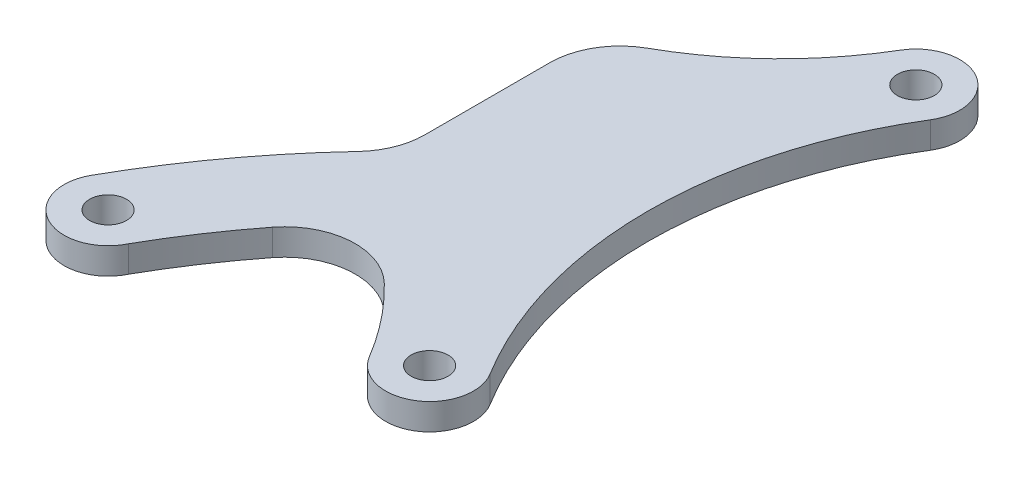
ISO-10303-21;
HEADER;
FILE_DESCRIPTION(('STEP AP214'),'2;1');
FILE_NAME('part.step','',(''),(''),'','','');
FILE_SCHEMA(('AUTOMOTIVE_DESIGN { 1 0 10303 214 1 1 1 1 }'));
ENDSEC;
DATA;
#1=APPLICATION_CONTEXT('core data for automotive mechanical design processes');
#2=APPLICATION_PROTOCOL_DEFINITION('international standard','automotive_design',2000,#1);
#3=PRODUCT_CONTEXT('',#1,'mechanical');
#4=PRODUCT('Part','Part','',(#3));
#5=PRODUCT_RELATED_PRODUCT_CATEGORY('part','',(#4));
#6=PRODUCT_DEFINITION_FORMATION('','',#4);
#7=PRODUCT_DEFINITION_CONTEXT('part definition',#1,'design');
#8=PRODUCT_DEFINITION('design','',#6,#7);
#9=PRODUCT_DEFINITION_SHAPE('','',#8);
#10=(LENGTH_UNIT() NAMED_UNIT(*) SI_UNIT(.MILLI.,.METRE.));
#11=(NAMED_UNIT(*) PLANE_ANGLE_UNIT() SI_UNIT($,.RADIAN.));
#12=(NAMED_UNIT(*) SI_UNIT($,.STERADIAN.) SOLID_ANGLE_UNIT());
#13=UNCERTAINTY_MEASURE_WITH_UNIT(LENGTH_MEASURE(1.E-05),#10,'distance_accuracy_value','');
#14=(GEOMETRIC_REPRESENTATION_CONTEXT(3) GLOBAL_UNCERTAINTY_ASSIGNED_CONTEXT((#13)) GLOBAL_UNIT_ASSIGNED_CONTEXT((#10,
#11,#12)) REPRESENTATION_CONTEXT('',''));
#15=CARTESIAN_POINT('',(0.,0.,0.));
#16=DIRECTION('',(0.,0.,1.));
#17=DIRECTION('',(1.,0.,0.));
#18=AXIS2_PLACEMENT_3D('',#15,#16,#17);
#19=CARTESIAN_POINT('',(0.,3.,0.));
#20=DIRECTION('',(-1.,0.,0.));
#21=DIRECTION('',(0.,0.,1.));
#22=AXIS2_PLACEMENT_3D('',#19,#20,#21);
#23=PLANE('',#22);
#24=DIRECTION('',(0.,0.,-1.));
#25=VECTOR('',#24,1.);
#26=CARTESIAN_POINT('',(0.,3.,0.));
#27=LINE('',#26,#25);
#28=CARTESIAN_POINT('',(0.,3.,5.15464700704357));
#29=VERTEX_POINT('',#28);
#30=CARTESIAN_POINT('',(0.,3.,-9.00422180832725));
#31=VERTEX_POINT('',#30);
#32=EDGE_CURVE('E158',#29,#31,#27,.T.);
#33=ORIENTED_EDGE('',*,*,#32,.T.);
#34=DIRECTION('',(0.,1.,0.));
#35=VECTOR('',#34,1.);
#36=CARTESIAN_POINT('',(0.,0.,-9.00422180832725));
#37=LINE('',#36,#35);
#38=CARTESIAN_POINT('',(0.,0.,-9.00422180832725));
#39=VERTEX_POINT('',#38);
#40=EDGE_CURVE('E261',#31,#39,#37,.F.);
#41=ORIENTED_EDGE('',*,*,#40,.T.);
#42=DIRECTION('',(0.,0.,-1.));
#43=VECTOR('',#42,1.);
#44=CARTESIAN_POINT('',(0.,0.,0.));
#45=LINE('',#44,#43);
#46=CARTESIAN_POINT('',(0.,0.,5.15464700704357));
#47=VERTEX_POINT('',#46);
#48=EDGE_CURVE('E196',#47,#39,#45,.T.);
#49=ORIENTED_EDGE('',*,*,#48,.F.);
#50=DIRECTION('',(0.,1.,0.));
#51=VECTOR('',#50,1.);
#52=CARTESIAN_POINT('',(0.,3.,5.15464700704357));
#53=LINE('',#52,#51);
#54=EDGE_CURVE('E258',#47,#29,#53,.T.);
#55=ORIENTED_EDGE('',*,*,#54,.T.);
#56=EDGE_LOOP('',(#33,#41,#49,#55));
#57=FACE_BOUND('',#56,.T.);
#58=ADVANCED_FACE('F41',(#57),#23,.T.);
#59=CARTESIAN_POINT('',(63.2934056347811,3.,71.9789128556918));
#60=DIRECTION('',(0.,-1.,0.));
#61=DIRECTION('',(0.,0.,-1.));
#62=AXIS2_PLACEMENT_3D('',#59,#60,#61);
#63=CYLINDRICAL_SURFACE('',#62,89.7150561234872);
#64=CARTESIAN_POINT('',(63.2934056347811,3.,71.9789128556918));
#65=DIRECTION('',(0.,1.,0.));
#66=DIRECTION('',(0.,0.,1.));
#67=AXIS2_PLACEMENT_3D('',#64,#65,#66);
#68=CIRCLE('',#67,89.7150561234872);
#69=CARTESIAN_POINT('',(-14.9841354073367,3.,28.1449321598889));
#70=VERTEX_POINT('',#69);
#71=CARTESIAN_POINT('',(-2.16315900839813,3.,10.6255963980319));
#72=VERTEX_POINT('',#71);
#73=EDGE_CURVE('E136',#70,#72,#68,.F.);
#74=ORIENTED_EDGE('',*,*,#73,.T.);
#75=DIRECTION('',(0.,-1.,0.));
#76=VECTOR('',#75,1.);
#77=CARTESIAN_POINT('',(-2.16315900839813,3.,10.6255963980319));
#78=LINE('',#77,#76);
#79=CARTESIAN_POINT('',(-2.16315900839813,0.,10.6255963980319));
#80=VERTEX_POINT('',#79);
#81=EDGE_CURVE('E273',#72,#80,#78,.T.);
#82=ORIENTED_EDGE('',*,*,#81,.T.);
#83=CARTESIAN_POINT('',(63.2934056347811,0.,71.9789128556918));
#84=DIRECTION('',(0.,1.,0.));
#85=DIRECTION('',(0.,0.,1.));
#86=AXIS2_PLACEMENT_3D('',#83,#84,#85);
#87=CIRCLE('',#86,89.7150561234872);
#88=CARTESIAN_POINT('',(-14.9841354073367,0.,28.1449321598889));
#89=VERTEX_POINT('',#88);
#90=EDGE_CURVE('E139',#89,#80,#87,.F.);
#91=ORIENTED_EDGE('',*,*,#90,.F.);
#92=DIRECTION('',(0.,-1.,0.));
#93=VECTOR('',#92,1.);
#94=CARTESIAN_POINT('',(-14.9841354073367,3.,28.1449321598889));
#95=LINE('',#94,#93);
#96=EDGE_CURVE('E132',#70,#89,#95,.T.);
#97=ORIENTED_EDGE('',*,*,#96,.F.);
#98=EDGE_LOOP('',(#74,#82,#91,#97));
#99=FACE_BOUND('',#98,.T.);
#100=ADVANCED_FACE('F134',(#99),#63,.T.);
#101=CARTESIAN_POINT('',(-10.6215710605913,3.,30.5878878124757));
#102=DIRECTION('',(0.,-1.,0.));
#103=DIRECTION('',(0.,0.,-1.));
#104=AXIS2_PLACEMENT_3D('',#101,#102,#103);
#105=CYLINDRICAL_SURFACE('',#104,5.);
#106=CARTESIAN_POINT('',(-10.6215710605913,0.,30.5878878124757));
#107=DIRECTION('',(0.,1.,0.));
#108=DIRECTION('',(0.,0.,1.));
#109=AXIS2_PLACEMENT_3D('',#106,#107,#108);
#110=CIRCLE('',#109,5.);
#111=CARTESIAN_POINT('',(-6.11371947179426,0.,32.7510507867752));
#112=VERTEX_POINT('',#111);
#113=EDGE_CURVE('E202',#89,#112,#110,.T.);
#114=ORIENTED_EDGE('',*,*,#113,.T.);
#115=DIRECTION('',(0.,-1.,0.));
#116=VECTOR('',#115,1.);
#117=CARTESIAN_POINT('',(-6.11371947179426,3.,32.7510507867752));
#118=LINE('',#117,#116);
#119=CARTESIAN_POINT('',(-6.11371947179426,3.,32.7510507867752));
#120=VERTEX_POINT('',#119);
#121=EDGE_CURVE('E144',#120,#112,#118,.T.);
#122=ORIENTED_EDGE('',*,*,#121,.F.);
#123=CARTESIAN_POINT('',(-10.6215710605913,3.,30.5878878124757));
#124=DIRECTION('',(0.,1.,0.));
#125=DIRECTION('',(0.,0.,1.));
#126=AXIS2_PLACEMENT_3D('',#123,#124,#125);
#127=CIRCLE('',#126,5.);
#128=EDGE_CURVE('E147',#70,#120,#127,.T.);
#129=ORIENTED_EDGE('',*,*,#128,.F.);
#130=ORIENTED_EDGE('',*,*,#96,.T.);
#131=EDGE_LOOP('',(#114,#122,#129,#130));
#132=FACE_BOUND('',#131,.T.);
#133=ADVANCED_FACE('F148',(#132),#105,.T.);
#134=CARTESIAN_POINT('',(63.2934056347817,3.,71.9789128556922));
#135=DIRECTION('',(0.,-1.,0.));
#136=DIRECTION('',(0.,0.,-1.));
#137=AXIS2_PLACEMENT_3D('',#134,#135,#136);
#138=CYLINDRICAL_SURFACE('',#137,79.7256180788702);
#139=CARTESIAN_POINT('',(63.2934056347817,0.,71.9789128556922));
#140=DIRECTION('',(0.,1.,0.));
#141=DIRECTION('',(0.,0.,1.));
#142=AXIS2_PLACEMENT_3D('',#139,#140,#141);
#143=CIRCLE('',#142,79.7256180788702);
#144=CARTESIAN_POINT('',(0.43927315495626,0.,22.9326876363502));
#145=VERTEX_POINT('',#144);
#146=EDGE_CURVE('E205',#112,#145,#143,.F.);
#147=ORIENTED_EDGE('',*,*,#146,.T.);
#148=DIRECTION('',(0.,-1.,0.));
#149=VECTOR('',#148,1.);
#150=CARTESIAN_POINT('',(0.439273154956246,3.,22.9326876363502));
#151=LINE('',#150,#149);
#152=CARTESIAN_POINT('',(0.43927315495626,3.,22.9326876363502));
#153=VERTEX_POINT('',#152);
#154=EDGE_CURVE('E255',#145,#153,#151,.F.);
#155=ORIENTED_EDGE('',*,*,#154,.T.);
#156=CARTESIAN_POINT('',(63.2934056347817,3.,71.9789128556922));
#157=DIRECTION('',(0.,1.,0.));
#158=DIRECTION('',(0.,0.,1.));
#159=AXIS2_PLACEMENT_3D('',#156,#157,#158);
#160=CIRCLE('',#159,79.7256180788702);
#161=EDGE_CURVE('E153',#120,#153,#160,.F.);
#162=ORIENTED_EDGE('',*,*,#161,.F.);
#163=ORIENTED_EDGE('',*,*,#121,.T.);
#164=EDGE_LOOP('',(#147,#155,#162,#163));
#165=FACE_BOUND('',#164,.T.);
#166=ADVANCED_FACE('F338',(#165),#138,.F.);
#167=CARTESIAN_POINT('',(-15.081183554011,3.,50.304084356289));
#168=DIRECTION('',(0.,-1.,0.));
#169=DIRECTION('',(0.,0.,-1.));
#170=AXIS2_PLACEMENT_3D('',#167,#168,#169);
#171=CYLINDRICAL_SURFACE('',#170,39.3119401497601);
#172=CARTESIAN_POINT('',(-15.081183554011,3.,50.304084356289));
#173=DIRECTION('',(0.,1.,0.));
#174=DIRECTION('',(0.,0.,1.));
#175=AXIS2_PLACEMENT_3D('',#172,#173,#174);
#176=CIRCLE('',#175,39.3119401497601);
#177=CARTESIAN_POINT('',(18.7030561711687,3.,30.2029952183864));
#178=VERTEX_POINT('',#177);
#179=CARTESIAN_POINT('',(12.3231049118581,3.,22.1183856419099));
#180=VERTEX_POINT('',#179);
#181=EDGE_CURVE('E167',#178,#180,#176,.T.);
#182=ORIENTED_EDGE('',*,*,#181,.T.);
#183=DIRECTION('',(0.,-1.,0.));
#184=VECTOR('',#183,1.);
#185=CARTESIAN_POINT('',(12.3231049118581,3.,22.1183856419099));
#186=LINE('',#185,#184);
#187=CARTESIAN_POINT('',(12.3231049118581,0.,22.1183856419099));
#188=VERTEX_POINT('',#187);
#189=EDGE_CURVE('E143',#180,#188,#186,.T.);
#190=ORIENTED_EDGE('',*,*,#189,.T.);
#191=CARTESIAN_POINT('',(-15.081183554011,0.,50.304084356289));
#192=DIRECTION('',(0.,1.,0.));
#193=DIRECTION('',(0.,0.,1.));
#194=AXIS2_PLACEMENT_3D('',#191,#192,#193);
#195=CIRCLE('',#194,39.3119401497601);
#196=CARTESIAN_POINT('',(18.7030561711687,0.,30.2029952183864));
#197=VERTEX_POINT('',#196);
#198=EDGE_CURVE('E209',#197,#188,#195,.T.);
#199=ORIENTED_EDGE('',*,*,#198,.F.);
#200=DIRECTION('',(0.,-1.,0.));
#201=VECTOR('',#200,1.);
#202=CARTESIAN_POINT('',(18.7030561711687,3.,30.2029952183864));
#203=LINE('',#202,#201);
#204=EDGE_CURVE('E247',#178,#197,#203,.T.);
#205=ORIENTED_EDGE('',*,*,#204,.F.);
#206=EDGE_LOOP('',(#182,#190,#199,#205));
#207=FACE_BOUND('',#206,.T.);
#208=ADVANCED_FACE('F316',(#207),#171,.F.);
#209=CARTESIAN_POINT('',(23.,3.,27.6463814947534));
#210=DIRECTION('',(0.,-1.,0.));
#211=DIRECTION('',(0.,0.,-1.));
#212=AXIS2_PLACEMENT_3D('',#209,#210,#211);
#213=CYLINDRICAL_SURFACE('',#212,4.99999999999999);
#214=CARTESIAN_POINT('',(23.,0.,27.6463814947534));
#215=DIRECTION('',(0.,1.,0.));
#216=DIRECTION('',(0.,0.,1.));
#217=AXIS2_PLACEMENT_3D('',#214,#215,#216);
#218=CIRCLE('',#217,4.99999999999999);
#219=CARTESIAN_POINT('',(27.2602311164125,0.,25.0290487236388));
#220=VERTEX_POINT('',#219);
#221=EDGE_CURVE('E213',#197,#220,#218,.T.);
#222=ORIENTED_EDGE('',*,*,#221,.T.);
#223=DIRECTION('',(0.,-1.,0.));
#224=VECTOR('',#223,1.);
#225=CARTESIAN_POINT('',(27.2602311164125,3.,25.0290487236388));
#226=LINE('',#225,#224);
#227=CARTESIAN_POINT('',(27.2602311164125,3.,25.0290487236388));
#228=VERTEX_POINT('',#227);
#229=EDGE_CURVE('E243',#228,#220,#226,.T.);
#230=ORIENTED_EDGE('',*,*,#229,.F.);
#231=CARTESIAN_POINT('',(23.,3.,27.6463814947534));
#232=DIRECTION('',(0.,1.,0.));
#233=DIRECTION('',(0.,0.,1.));
#234=AXIS2_PLACEMENT_3D('',#231,#232,#233);
#235=CIRCLE('',#234,4.99999999999999);
#236=EDGE_CURVE('E171',#178,#228,#235,.T.);
#237=ORIENTED_EDGE('',*,*,#236,.F.);
#238=ORIENTED_EDGE('',*,*,#204,.T.);
#239=EDGE_LOOP('',(#222,#230,#237,#238));
#240=FACE_BOUND('',#239,.T.);
#241=ADVANCED_FACE('F322',(#240),#213,.T.);
#242=CARTESIAN_POINT('',(68.,3.,0.));
#243=DIRECTION('',(0.,-1.,0.));
#244=DIRECTION('',(0.,0.,-1.));
#245=AXIS2_PLACEMENT_3D('',#242,#243,#244);
#246=CYLINDRICAL_SURFACE('',#245,47.8140361055037);
#247=CARTESIAN_POINT('',(68.,0.,0.));
#248=DIRECTION('',(0.,1.,0.));
#249=DIRECTION('',(0.,0.,1.));
#250=AXIS2_PLACEMENT_3D('',#247,#248,#249);
#251=CIRCLE('',#250,47.8140361055037);
#252=CARTESIAN_POINT('',(27.2602311164125,0.,-25.0290487236388));
#253=VERTEX_POINT('',#252);
#254=EDGE_CURVE('E216',#220,#253,#251,.F.);
#255=ORIENTED_EDGE('',*,*,#254,.T.);
#256=DIRECTION('',(0.,-1.,0.));
#257=VECTOR('',#256,1.);
#258=CARTESIAN_POINT('',(27.2602311164125,3.,-25.0290487236388));
#259=LINE('',#258,#257);
#260=CARTESIAN_POINT('',(27.2602311164125,3.,-25.0290487236388));
#261=VERTEX_POINT('',#260);
#262=EDGE_CURVE('E239',#261,#253,#259,.T.);
#263=ORIENTED_EDGE('',*,*,#262,.F.);
#264=CARTESIAN_POINT('',(68.,3.,0.));
#265=DIRECTION('',(0.,1.,0.));
#266=DIRECTION('',(0.,0.,1.));
#267=AXIS2_PLACEMENT_3D('',#264,#265,#266);
#268=CIRCLE('',#267,47.8140361055037);
#269=EDGE_CURVE('E174',#228,#261,#268,.F.);
#270=ORIENTED_EDGE('',*,*,#269,.F.);
#271=ORIENTED_EDGE('',*,*,#229,.T.);
#272=EDGE_LOOP('',(#255,#263,#270,#271));
#273=FACE_BOUND('',#272,.T.);
#274=ADVANCED_FACE('F328',(#273),#246,.F.);
#275=CARTESIAN_POINT('',(23.,3.,-27.6463814947534));
#276=DIRECTION('',(0.,-1.,0.));
#277=DIRECTION('',(0.,0.,-1.));
#278=AXIS2_PLACEMENT_3D('',#275,#276,#277);
#279=CYLINDRICAL_SURFACE('',#278,4.99999999999999);
#280=CARTESIAN_POINT('',(23.,0.,-27.6463814947534));
#281=DIRECTION('',(0.,1.,0.));
#282=DIRECTION('',(0.,0.,1.));
#283=AXIS2_PLACEMENT_3D('',#280,#281,#282);
#284=CIRCLE('',#283,4.99999999999999);
#285=CARTESIAN_POINT('',(18.7030561711687,0.,-30.2029952183864));
#286=VERTEX_POINT('',#285);
#287=EDGE_CURVE('E219',#253,#286,#284,.T.);
#288=ORIENTED_EDGE('',*,*,#287,.T.);
#289=DIRECTION('',(0.,-1.,0.));
#290=VECTOR('',#289,1.);
#291=CARTESIAN_POINT('',(18.7030561711687,3.,-30.2029952183864));
#292=LINE('',#291,#290);
#293=CARTESIAN_POINT('',(18.7030561711687,3.,-30.2029952183864));
#294=VERTEX_POINT('',#293);
#295=EDGE_CURVE('E195',#294,#286,#292,.T.);
#296=ORIENTED_EDGE('',*,*,#295,.F.);
#297=CARTESIAN_POINT('',(23.,3.,-27.6463814947534));
#298=DIRECTION('',(0.,1.,0.));
#299=DIRECTION('',(0.,0.,1.));
#300=AXIS2_PLACEMENT_3D('',#297,#298,#299);
#301=CIRCLE('',#300,4.99999999999999);
#302=EDGE_CURVE('E177',#261,#294,#301,.T.);
#303=ORIENTED_EDGE('',*,*,#302,.F.);
#304=ORIENTED_EDGE('',*,*,#262,.T.);
#305=EDGE_LOOP('',(#288,#296,#303,#304));
#306=FACE_BOUND('',#305,.T.);
#307=ADVANCED_FACE('F332',(#306),#279,.T.);
#308=CARTESIAN_POINT('',(23.,3.,-27.6463814947534));
#309=DIRECTION('',(0.,-1.,0.));
#310=DIRECTION('',(0.,0.,-1.));
#311=AXIS2_PLACEMENT_3D('',#308,#309,#310);
#312=CYLINDRICAL_SURFACE('',#311,2.09999999999999);
#313=CARTESIAN_POINT('',(23.,3.,-27.6463814947534));
#314=DIRECTION('',(0.,1.,0.));
#315=DIRECTION('',(0.,0.,1.));
#316=AXIS2_PLACEMENT_3D('',#313,#314,#315);
#317=CIRCLE('',#316,2.09999999999999);
#318=CARTESIAN_POINT('',(23.,3.,-25.5463814947534));
#319=VERTEX_POINT('',#318);
#320=EDGE_CURVE('E187',#319,#319,#317,.T.);
#321=ORIENTED_EDGE('',*,*,#320,.T.);
#322=EDGE_LOOP('',(#321));
#323=FACE_BOUND('',#322,.T.);
#324=CARTESIAN_POINT('',(23.,0.,-27.6463814947534));
#325=DIRECTION('',(0.,1.,0.));
#326=DIRECTION('',(0.,0.,1.));
#327=AXIS2_PLACEMENT_3D('',#324,#325,#326);
#328=CIRCLE('',#327,2.09999999999999);
#329=CARTESIAN_POINT('',(23.,0.,-25.5463814947534));
#330=VERTEX_POINT('',#329);
#331=EDGE_CURVE('E229',#330,#330,#328,.T.);
#332=ORIENTED_EDGE('',*,*,#331,.F.);
#333=EDGE_LOOP('',(#332));
#334=FACE_BOUND('',#333,.T.);
#335=ADVANCED_FACE('F353',(#323,#334),#312,.F.);
#336=CARTESIAN_POINT('',(-10.6215710605966,3.,30.5878878124869));
#337=DIRECTION('',(0.,-1.,0.));
#338=DIRECTION('',(0.,0.,-1.));
#339=AXIS2_PLACEMENT_3D('',#336,#337,#338);
#340=CYLINDRICAL_SURFACE('',#339,2.10000000000002);
#341=CARTESIAN_POINT('',(-10.6215710605966,3.,30.5878878124869));
#342=DIRECTION('',(0.,1.,0.));
#343=DIRECTION('',(0.,0.,1.));
#344=AXIS2_PLACEMENT_3D('',#341,#342,#343);
#345=CIRCLE('',#344,2.10000000000002);
#346=CARTESIAN_POINT('',(-10.6215710605966,3.,32.6878878124869));
#347=VERTEX_POINT('',#346);
#348=EDGE_CURVE('E183',#347,#347,#345,.T.);
#349=ORIENTED_EDGE('',*,*,#348,.T.);
#350=EDGE_LOOP('',(#349));
#351=FACE_BOUND('',#350,.T.);
#352=CARTESIAN_POINT('',(-10.6215710605966,0.,30.5878878124869));
#353=DIRECTION('',(0.,1.,0.));
#354=DIRECTION('',(0.,0.,1.));
#355=AXIS2_PLACEMENT_3D('',#352,#353,#354);
#356=CIRCLE('',#355,2.10000000000002);
#357=CARTESIAN_POINT('',(-10.6215710605966,0.,32.6878878124869));
#358=VERTEX_POINT('',#357);
#359=EDGE_CURVE('E225',#358,#358,#356,.T.);
#360=ORIENTED_EDGE('',*,*,#359,.F.);
#361=EDGE_LOOP('',(#360));
#362=FACE_BOUND('',#361,.T.);
#363=ADVANCED_FACE('F357',(#351,#362),#340,.F.);
#364=CARTESIAN_POINT('',(-15.081183554011,3.,-50.304084356289));
#365=DIRECTION('',(0.,-1.,0.));
#366=DIRECTION('',(0.,0.,-1.));
#367=AXIS2_PLACEMENT_3D('',#364,#365,#366);
#368=CYLINDRICAL_SURFACE('',#367,39.3119401497601);
#369=CARTESIAN_POINT('',(-15.081183554011,0.,-50.304084356289));
#370=DIRECTION('',(0.,1.,0.));
#371=DIRECTION('',(0.,0.,1.));
#372=AXIS2_PLACEMENT_3D('',#369,#370,#371);
#373=CIRCLE('',#372,39.3119401497601);
#374=CARTESIAN_POINT('',(4.09719094487347,0.,-15.9876365517907));
#375=VERTEX_POINT('',#374);
#376=EDGE_CURVE('E222',#286,#375,#373,.F.);
#377=ORIENTED_EDGE('',*,*,#376,.T.);
#378=DIRECTION('',(0.,-1.,0.));
#379=VECTOR('',#378,1.);
#380=CARTESIAN_POINT('',(4.09719094487347,3.,-15.9876365517907));
#381=LINE('',#380,#379);
#382=CARTESIAN_POINT('',(4.09719094487347,3.,-15.9876365517907));
#383=VERTEX_POINT('',#382);
#384=EDGE_CURVE('E63',#375,#383,#381,.F.);
#385=ORIENTED_EDGE('',*,*,#384,.T.);
#386=CARTESIAN_POINT('',(-15.081183554011,3.,-50.304084356289));
#387=DIRECTION('',(0.,1.,0.));
#388=DIRECTION('',(0.,0.,1.));
#389=AXIS2_PLACEMENT_3D('',#386,#387,#388);
#390=CIRCLE('',#389,39.3119401497601);
#391=EDGE_CURVE('E180',#294,#383,#390,.F.);
#392=ORIENTED_EDGE('',*,*,#391,.F.);
#393=ORIENTED_EDGE('',*,*,#295,.T.);
#394=EDGE_LOOP('',(#377,#385,#392,#393));
#395=FACE_BOUND('',#394,.T.);
#396=ADVANCED_FACE('F334',(#395),#368,.F.);
#397=CARTESIAN_POINT('',(23.,3.,27.6463814947534));
#398=DIRECTION('',(0.,-1.,0.));
#399=DIRECTION('',(0.,0.,-1.));
#400=AXIS2_PLACEMENT_3D('',#397,#398,#399);
#401=CYLINDRICAL_SURFACE('',#400,2.09999999999999);
#402=CARTESIAN_POINT('',(23.,3.,27.6463814947534));
#403=DIRECTION('',(0.,1.,0.));
#404=DIRECTION('',(0.,0.,1.));
#405=AXIS2_PLACEMENT_3D('',#402,#403,#404);
#406=CIRCLE('',#405,2.09999999999999);
#407=CARTESIAN_POINT('',(23.,3.,29.7463814947534));
#408=VERTEX_POINT('',#407);
#409=EDGE_CURVE('E191',#408,#408,#406,.T.);
#410=ORIENTED_EDGE('',*,*,#409,.T.);
#411=EDGE_LOOP('',(#410));
#412=FACE_BOUND('',#411,.T.);
#413=CARTESIAN_POINT('',(23.,0.,27.6463814947534));
#414=DIRECTION('',(0.,1.,0.));
#415=DIRECTION('',(0.,0.,1.));
#416=AXIS2_PLACEMENT_3D('',#413,#414,#415);
#417=CIRCLE('',#416,2.09999999999999);
#418=CARTESIAN_POINT('',(23.,0.,29.7463814947534));
#419=VERTEX_POINT('',#418);
#420=EDGE_CURVE('E162',#419,#419,#417,.T.);
#421=ORIENTED_EDGE('',*,*,#420,.F.);
#422=EDGE_LOOP('',(#421));
#423=FACE_BOUND('',#422,.T.);
#424=ADVANCED_FACE('F356',(#412,#423),#401,.F.);
#425=CARTESIAN_POINT('',(0.,3.,0.));
#426=DIRECTION('',(0.,1.,0.));
#427=DIRECTION('',(0.,0.,1.));
#428=AXIS2_PLACEMENT_3D('',#425,#426,#427);
#429=PLANE('',#428);
#430=ORIENTED_EDGE('',*,*,#391,.T.);
#431=CARTESIAN_POINT('',(8.,3.,-9.00422180832725));
#432=DIRECTION('',(0.,1.,0.));
#433=DIRECTION('',(0.,0.,1.));
#434=AXIS2_PLACEMENT_3D('',#431,#432,#433);
#435=CIRCLE('',#434,8.);
#436=EDGE_CURVE('E270',#383,#31,#435,.T.);
#437=ORIENTED_EDGE('',*,*,#436,.T.);
#438=ORIENTED_EDGE('',*,*,#32,.F.);
#439=CARTESIAN_POINT('',(-8.00000000000001,3.,5.15464700704357));
#440=DIRECTION('',(0.,1.,0.));
#441=DIRECTION('',(0.,0.,1.));
#442=AXIS2_PLACEMENT_3D('',#439,#440,#441);
#443=CIRCLE('',#442,8.);
#444=EDGE_CURVE('E11',#29,#72,#443,.F.);
#445=ORIENTED_EDGE('',*,*,#444,.T.);
#446=ORIENTED_EDGE('',*,*,#73,.F.);
#447=ORIENTED_EDGE('',*,*,#128,.T.);
#448=ORIENTED_EDGE('',*,*,#161,.T.);
#449=CARTESIAN_POINT('',(6.74631814194106,3.,27.8541897985106));
#450=DIRECTION('',(0.,1.,0.));
#451=DIRECTION('',(0.,0.,1.));
#452=AXIS2_PLACEMENT_3D('',#449,#450,#451);
#453=CIRCLE('',#452,8.);
#454=EDGE_CURVE('E279',#153,#180,#453,.F.);
#455=ORIENTED_EDGE('',*,*,#454,.T.);
#456=ORIENTED_EDGE('',*,*,#181,.F.);
#457=ORIENTED_EDGE('',*,*,#236,.T.);
#458=ORIENTED_EDGE('',*,*,#269,.T.);
#459=ORIENTED_EDGE('',*,*,#302,.T.);
#460=EDGE_LOOP('',(#430,#437,#438,#445,#446,#447,#448,#455,#456,#457,#458,#459));
#461=FACE_BOUND('',#460,.T.);
#462=ORIENTED_EDGE('',*,*,#348,.F.);
#463=EDGE_LOOP('',(#462));
#464=FACE_BOUND('',#463,.T.);
#465=ORIENTED_EDGE('',*,*,#320,.F.);
#466=EDGE_LOOP('',(#465));
#467=FACE_BOUND('',#466,.T.);
#468=ORIENTED_EDGE('',*,*,#409,.F.);
#469=EDGE_LOOP('',(#468));
#470=FACE_BOUND('',#469,.T.);
#471=ADVANCED_FACE('F155',(#461,#464,#467,#470),#429,.T.);
#472=CARTESIAN_POINT('',(0.,0.,0.));
#473=DIRECTION('',(0.,1.,0.));
#474=DIRECTION('',(0.,0.,1.));
#475=AXIS2_PLACEMENT_3D('',#472,#473,#474);
#476=PLANE('',#475);
#477=ORIENTED_EDGE('',*,*,#48,.T.);
#478=CARTESIAN_POINT('',(8.,0.,-9.00422180832725));
#479=DIRECTION('',(0.,1.,0.));
#480=DIRECTION('',(0.,0.,1.));
#481=AXIS2_PLACEMENT_3D('',#478,#479,#480);
#482=CIRCLE('',#481,8.);
#483=EDGE_CURVE('E265',#39,#375,#482,.F.);
#484=ORIENTED_EDGE('',*,*,#483,.T.);
#485=ORIENTED_EDGE('',*,*,#376,.F.);
#486=ORIENTED_EDGE('',*,*,#287,.F.);
#487=ORIENTED_EDGE('',*,*,#254,.F.);
#488=ORIENTED_EDGE('',*,*,#221,.F.);
#489=ORIENTED_EDGE('',*,*,#198,.T.);
#490=CARTESIAN_POINT('',(6.74631814194106,0.,27.8541897985106));
#491=DIRECTION('',(0.,1.,0.));
#492=DIRECTION('',(0.,0.,1.));
#493=AXIS2_PLACEMENT_3D('',#490,#491,#492);
#494=CIRCLE('',#493,8.);
#495=EDGE_CURVE('E276',#188,#145,#494,.T.);
#496=ORIENTED_EDGE('',*,*,#495,.T.);
#497=ORIENTED_EDGE('',*,*,#146,.F.);
#498=ORIENTED_EDGE('',*,*,#113,.F.);
#499=ORIENTED_EDGE('',*,*,#90,.T.);
#500=CARTESIAN_POINT('',(-8.00000000000001,0.,5.15464700704357));
#501=DIRECTION('',(0.,1.,0.));
#502=DIRECTION('',(0.,0.,1.));
#503=AXIS2_PLACEMENT_3D('',#500,#501,#502);
#504=CIRCLE('',#503,8.);
#505=EDGE_CURVE('E50',#80,#47,#504,.T.);
#506=ORIENTED_EDGE('',*,*,#505,.T.);
#507=EDGE_LOOP('',(#477,#484,#485,#486,#487,#488,#489,#496,#497,#498,#499,#506));
#508=FACE_BOUND('',#507,.T.);
#509=ORIENTED_EDGE('',*,*,#359,.T.);
#510=EDGE_LOOP('',(#509));
#511=FACE_BOUND('',#510,.T.);
#512=ORIENTED_EDGE('',*,*,#331,.T.);
#513=EDGE_LOOP('',(#512));
#514=FACE_BOUND('',#513,.T.);
#515=ORIENTED_EDGE('',*,*,#420,.T.);
#516=EDGE_LOOP('',(#515));
#517=FACE_BOUND('',#516,.T.);
#518=ADVANCED_FACE('F284',(#508,#511,#514,#517),#476,.F.);
#519=CARTESIAN_POINT('',(6.74631814194106,3.,27.8541897985106));
#520=DIRECTION('',(0.,1.,0.));
#521=DIRECTION('',(0.,0.,1.));
#522=AXIS2_PLACEMENT_3D('',#519,#520,#521);
#523=CYLINDRICAL_SURFACE('',#522,8.);
#524=ORIENTED_EDGE('',*,*,#454,.F.);
#525=ORIENTED_EDGE('',*,*,#154,.F.);
#526=ORIENTED_EDGE('',*,*,#495,.F.);
#527=ORIENTED_EDGE('',*,*,#189,.F.);
#528=EDGE_LOOP('',(#524,#525,#526,#527));
#529=FACE_BOUND('',#528,.T.);
#530=ADVANCED_FACE('F295',(#529),#523,.F.);
#531=CARTESIAN_POINT('',(8.,3.,-9.00422180832725));
#532=DIRECTION('',(0.,-1.,0.));
#533=DIRECTION('',(0.,0.,-1.));
#534=AXIS2_PLACEMENT_3D('',#531,#532,#533);
#535=CYLINDRICAL_SURFACE('',#534,8.);
#536=ORIENTED_EDGE('',*,*,#436,.F.);
#537=ORIENTED_EDGE('',*,*,#384,.F.);
#538=ORIENTED_EDGE('',*,*,#483,.F.);
#539=ORIENTED_EDGE('',*,*,#40,.F.);
#540=EDGE_LOOP('',(#536,#537,#538,#539));
#541=FACE_BOUND('',#540,.T.);
#542=ADVANCED_FACE('F291',(#541),#535,.T.);
#543=CARTESIAN_POINT('',(-8.00000000000001,3.,5.15464700704357));
#544=DIRECTION('',(0.,-1.,0.));
#545=DIRECTION('',(0.,0.,-1.));
#546=AXIS2_PLACEMENT_3D('',#543,#544,#545);
#547=CYLINDRICAL_SURFACE('',#546,8.);
#548=ORIENTED_EDGE('',*,*,#444,.F.);
#549=ORIENTED_EDGE('',*,*,#54,.F.);
#550=ORIENTED_EDGE('',*,*,#505,.F.);
#551=ORIENTED_EDGE('',*,*,#81,.F.);
#552=EDGE_LOOP('',(#548,#549,#550,#551));
#553=FACE_BOUND('',#552,.T.);
#554=ADVANCED_FACE('F43',(#553),#547,.F.);
#555=CLOSED_SHELL('',(#58,#100,#133,#166,#208,#241,#274,#307,#335,#363,#396,#424,#471,#518,#530,
#542,#554));
#556=MANIFOLD_SOLID_BREP('B2',#555);
#557=ADVANCED_BREP_SHAPE_REPRESENTATION('',(#18,#556),#14);
#558=SHAPE_DEFINITION_REPRESENTATION(#9,#557);
ENDSEC;
END-ISO-10303-21;
